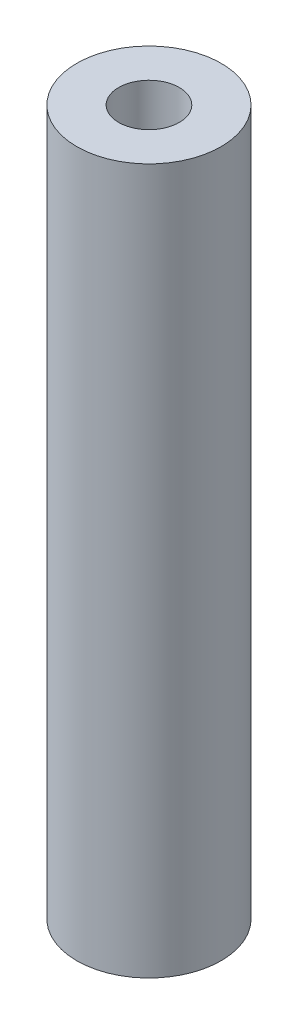
ISO-10303-21;
HEADER;
FILE_DESCRIPTION(('STEP AP214'),'2;1');
FILE_NAME('part.step','',(''),(''),'','','');
FILE_SCHEMA(('AUTOMOTIVE_DESIGN { 1 0 10303 214 1 1 1 1 }'));
ENDSEC;
DATA;
#1=APPLICATION_CONTEXT('core data for automotive mechanical design processes');
#2=APPLICATION_PROTOCOL_DEFINITION('international standard','automotive_design',2000,#1);
#3=PRODUCT_CONTEXT('',#1,'mechanical');
#4=PRODUCT('Part','Part','',(#3));
#5=PRODUCT_RELATED_PRODUCT_CATEGORY('part','',(#4));
#6=PRODUCT_DEFINITION_FORMATION('','',#4);
#7=PRODUCT_DEFINITION_CONTEXT('part definition',#1,'design');
#8=PRODUCT_DEFINITION('design','',#6,#7);
#9=PRODUCT_DEFINITION_SHAPE('','',#8);
#10=(LENGTH_UNIT() NAMED_UNIT(*) SI_UNIT(.MILLI.,.METRE.));
#11=(NAMED_UNIT(*) PLANE_ANGLE_UNIT() SI_UNIT($,.RADIAN.));
#12=(NAMED_UNIT(*) SI_UNIT($,.STERADIAN.) SOLID_ANGLE_UNIT());
#13=UNCERTAINTY_MEASURE_WITH_UNIT(LENGTH_MEASURE(1.E-05),#10,'distance_accuracy_value','');
#14=(GEOMETRIC_REPRESENTATION_CONTEXT(3) GLOBAL_UNCERTAINTY_ASSIGNED_CONTEXT((#13)) GLOBAL_UNIT_ASSIGNED_CONTEXT((#10,
#11,#12)) REPRESENTATION_CONTEXT('',''));
#15=CARTESIAN_POINT('',(0.,0.,0.));
#16=DIRECTION('',(0.,0.,1.));
#17=DIRECTION('',(1.,0.,0.));
#18=AXIS2_PLACEMENT_3D('',#15,#16,#17);
#19=CARTESIAN_POINT('',(0.,62.,0.));
#20=DIRECTION('',(0.,1.,0.));
#21=DIRECTION('',(0.,0.,1.));
#22=AXIS2_PLACEMENT_3D('',#19,#20,#21);
#23=PLANE('',#22);
#24=CARTESIAN_POINT('',(0.,62.,0.));
#25=DIRECTION('',(0.,1.,0.));
#26=DIRECTION('',(0.,0.,1.));
#27=AXIS2_PLACEMENT_3D('',#24,#25,#26);
#28=CIRCLE('',#27,6.35);
#29=CARTESIAN_POINT('',(0.,62.,6.35));
#30=VERTEX_POINT('',#29);
#31=EDGE_CURVE('E10',#30,#30,#28,.T.);
#32=ORIENTED_EDGE('',*,*,#31,.T.);
#33=EDGE_LOOP('',(#32));
#34=FACE_BOUND('',#33,.T.);
#35=CARTESIAN_POINT('',(0.,62.,0.));
#36=DIRECTION('',(0.,1.,0.));
#37=DIRECTION('',(0.,0.,1.));
#38=AXIS2_PLACEMENT_3D('',#35,#36,#37);
#39=CIRCLE('',#38,2.665);
#40=CARTESIAN_POINT('',(0.,62.,2.665));
#41=VERTEX_POINT('',#40);
#42=EDGE_CURVE('E48',#41,#41,#39,.T.);
#43=ORIENTED_EDGE('',*,*,#42,.F.);
#44=EDGE_LOOP('',(#43));
#45=FACE_BOUND('',#44,.T.);
#46=ADVANCED_FACE('F34',(#34,#45),#23,.T.);
#47=CARTESIAN_POINT('',(0.,0.,0.));
#48=DIRECTION('',(0.,1.,0.));
#49=DIRECTION('',(0.,0.,1.));
#50=AXIS2_PLACEMENT_3D('',#47,#48,#49);
#51=PLANE('',#50);
#52=CARTESIAN_POINT('',(0.,0.,0.));
#53=DIRECTION('',(0.,1.,0.));
#54=DIRECTION('',(0.,0.,1.));
#55=AXIS2_PLACEMENT_3D('',#52,#53,#54);
#56=CIRCLE('',#55,6.35);
#57=CARTESIAN_POINT('',(0.,0.,6.35));
#58=VERTEX_POINT('',#57);
#59=EDGE_CURVE('E38',#58,#58,#56,.T.);
#60=ORIENTED_EDGE('',*,*,#59,.F.);
#61=EDGE_LOOP('',(#60));
#62=FACE_BOUND('',#61,.T.);
#63=CARTESIAN_POINT('',(0.,0.,0.));
#64=DIRECTION('',(0.,1.,0.));
#65=DIRECTION('',(0.,0.,1.));
#66=AXIS2_PLACEMENT_3D('',#63,#64,#65);
#67=CIRCLE('',#66,2.665);
#68=CARTESIAN_POINT('',(0.,0.,2.665));
#69=VERTEX_POINT('',#68);
#70=EDGE_CURVE('E50',#69,#69,#67,.T.);
#71=ORIENTED_EDGE('',*,*,#70,.T.);
#72=EDGE_LOOP('',(#71));
#73=FACE_BOUND('',#72,.T.);
#74=ADVANCED_FACE('F61',(#62,#73),#51,.F.);
#75=CARTESIAN_POINT('',(0.,62.,0.));
#76=DIRECTION('',(0.,-1.,0.));
#77=DIRECTION('',(0.,0.,-1.));
#78=AXIS2_PLACEMENT_3D('',#75,#76,#77);
#79=CYLINDRICAL_SURFACE('',#78,6.35);
#80=ORIENTED_EDGE('',*,*,#31,.F.);
#81=EDGE_LOOP('',(#80));
#82=FACE_BOUND('',#81,.T.);
#83=ORIENTED_EDGE('',*,*,#59,.T.);
#84=EDGE_LOOP('',(#83));
#85=FACE_BOUND('',#84,.T.);
#86=ADVANCED_FACE('F36',(#82,#85),#79,.T.);
#87=CARTESIAN_POINT('',(0.,62.,0.));
#88=DIRECTION('',(0.,-1.,0.));
#89=DIRECTION('',(0.,0.,-1.));
#90=AXIS2_PLACEMENT_3D('',#87,#88,#89);
#91=CYLINDRICAL_SURFACE('',#90,2.665);
#92=ORIENTED_EDGE('',*,*,#42,.T.);
#93=EDGE_LOOP('',(#92));
#94=FACE_BOUND('',#93,.T.);
#95=ORIENTED_EDGE('',*,*,#70,.F.);
#96=EDGE_LOOP('',(#95));
#97=FACE_BOUND('',#96,.T.);
#98=ADVANCED_FACE('F57',(#94,#97),#91,.F.);
#99=CLOSED_SHELL('',(#46,#74,#86,#98));
#100=MANIFOLD_SOLID_BREP('B2',#99);
#101=ADVANCED_BREP_SHAPE_REPRESENTATION('',(#18,#100),#14);
#102=SHAPE_DEFINITION_REPRESENTATION(#9,#101);
ENDSEC;
END-ISO-10303-21;
